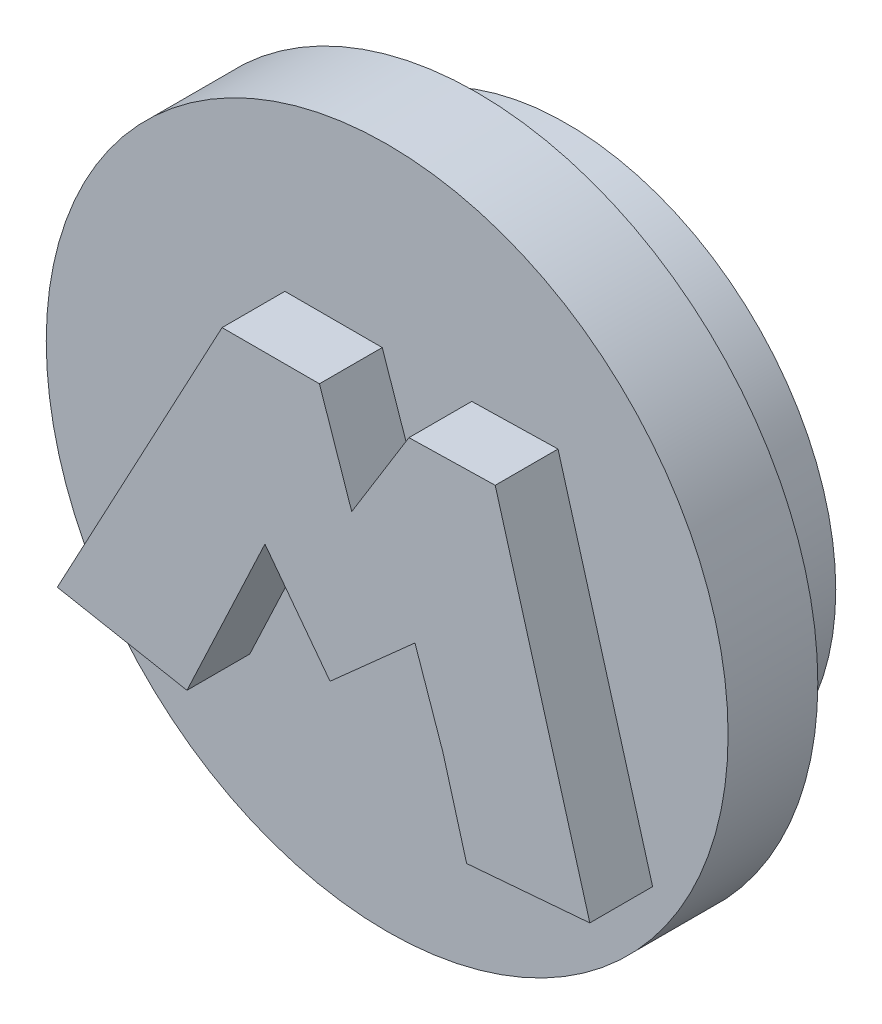
ISO-10303-21;
HEADER;
FILE_DESCRIPTION(('STEP AP214'),'2;1');
FILE_NAME('part.step','',(''),(''),'','','');
FILE_SCHEMA(('AUTOMOTIVE_DESIGN { 1 0 10303 214 1 1 1 1 }'));
ENDSEC;
DATA;
#1=APPLICATION_CONTEXT('core data for automotive mechanical design processes');
#2=APPLICATION_PROTOCOL_DEFINITION('international standard','automotive_design',2000,#1);
#3=PRODUCT_CONTEXT('',#1,'mechanical');
#4=PRODUCT('Part','Part','',(#3));
#5=PRODUCT_RELATED_PRODUCT_CATEGORY('part','',(#4));
#6=PRODUCT_DEFINITION_FORMATION('','',#4);
#7=PRODUCT_DEFINITION_CONTEXT('part definition',#1,'design');
#8=PRODUCT_DEFINITION('design','',#6,#7);
#9=PRODUCT_DEFINITION_SHAPE('','',#8);
#10=(LENGTH_UNIT() NAMED_UNIT(*) SI_UNIT(.MILLI.,.METRE.));
#11=(NAMED_UNIT(*) PLANE_ANGLE_UNIT() SI_UNIT($,.RADIAN.));
#12=(NAMED_UNIT(*) SI_UNIT($,.STERADIAN.) SOLID_ANGLE_UNIT());
#13=UNCERTAINTY_MEASURE_WITH_UNIT(LENGTH_MEASURE(1.E-05),#10,'distance_accuracy_value','');
#14=(GEOMETRIC_REPRESENTATION_CONTEXT(3) GLOBAL_UNCERTAINTY_ASSIGNED_CONTEXT((#13)) GLOBAL_UNIT_ASSIGNED_CONTEXT((#10,
#11,#12)) REPRESENTATION_CONTEXT('',''));
#15=CARTESIAN_POINT('',(0.,0.,0.));
#16=DIRECTION('',(0.,0.,1.));
#17=DIRECTION('',(1.,0.,0.));
#18=AXIS2_PLACEMENT_3D('',#15,#16,#17);
#19=CARTESIAN_POINT('',(0.,0.,2.5));
#20=DIRECTION('',(0.,0.,1.));
#21=DIRECTION('',(1.,0.,0.));
#22=AXIS2_PLACEMENT_3D('',#19,#20,#21);
#23=PLANE('',#22);
#24=CARTESIAN_POINT('',(0.,0.,2.5));
#25=DIRECTION('',(0.,0.,1.));
#26=DIRECTION('',(1.,0.,0.));
#27=AXIS2_PLACEMENT_3D('',#24,#25,#26);
#28=CIRCLE('',#27,19.);
#29=CARTESIAN_POINT('',(19.,0.,2.5));
#30=VERTEX_POINT('',#29);
#31=EDGE_CURVE('E55',#30,#30,#28,.T.);
#32=ORIENTED_EDGE('',*,*,#31,.T.);
#33=EDGE_LOOP('',(#32));
#34=FACE_BOUND('',#33,.T.);
#35=DIRECTION('',(-0.425937528266474,-0.904752575024933,0.));
#36=VECTOR('',#35,1.);
#37=CARTESIAN_POINT('',(-3.31142578125,-0.203388671875002,2.5));
#38=LINE('',#37,#36);
#39=CARTESIAN_POINT('',(-3.31142578125,-0.203388671875002,2.5));
#40=VERTEX_POINT('',#39);
#41=CARTESIAN_POINT('',(-7.65720703125,-9.434453125,2.5));
#42=VERTEX_POINT('',#41);
#43=EDGE_CURVE('E227',#40,#42,#38,.T.);
#44=ORIENTED_EDGE('',*,*,#43,.T.);
#45=DIRECTION('',(-0.982699902127382,0.185205027898364,0.));
#46=VECTOR('',#45,1.);
#47=CARTESIAN_POINT('',(-7.65720703125,-9.434453125,2.5));
#48=LINE('',#47,#46);
#49=CARTESIAN_POINT('',(-14.8828125,-8.07267578125,2.5));
#50=VERTEX_POINT('',#49);
#51=EDGE_CURVE('E63',#42,#50,#48,.T.);
#52=ORIENTED_EDGE('',*,*,#51,.T.);
#53=DIRECTION('',(0.472614608135408,0.881269216628503,0.));
#54=VECTOR('',#53,1.);
#55=CARTESIAN_POINT('',(-14.8828125,-8.07267578125,2.5));
#56=LINE('',#55,#54);
#57=CARTESIAN_POINT('',(-5.7001171875,9.05,2.5));
#58=VERTEX_POINT('',#57);
#59=EDGE_CURVE('E186',#50,#58,#56,.T.);
#60=ORIENTED_EDGE('',*,*,#59,.T.);
#61=DIRECTION('',(1.,0.,0.));
#62=VECTOR('',#61,1.);
#63=CARTESIAN_POINT('',(-5.7001171875,9.05,2.5));
#64=LINE('',#63,#62);
#65=CARTESIAN_POINT('',(-0.275332031249999,9.05,2.5));
#66=VERTEX_POINT('',#65);
#67=EDGE_CURVE('E190',#58,#66,#64,.T.);
#68=ORIENTED_EDGE('',*,*,#67,.T.);
#69=DIRECTION('',(0.323435777022933,-0.946250124513372,0.));
#70=VECTOR('',#69,1.);
#71=CARTESIAN_POINT('',(-0.275332031249999,9.05,2.5));
#72=LINE('',#71,#70);
#73=CARTESIAN_POINT('',(1.52548828125,3.781484375,2.5));
#74=VERTEX_POINT('',#73);
#75=EDGE_CURVE('E194',#66,#74,#72,.T.);
#76=ORIENTED_EDGE('',*,*,#75,.T.);
#77=DIRECTION('',(0.525362362031234,0.850878598015582,0.));
#78=VECTOR('',#77,1.);
#79=CARTESIAN_POINT('',(1.52548828125,3.781484375,2.5));
#80=LINE('',#79,#78);
#81=CARTESIAN_POINT('',(4.714130859375,8.9458203125,2.5));
#82=VERTEX_POINT('',#81);
#83=EDGE_CURVE('E198',#74,#82,#80,.T.);
#84=ORIENTED_EDGE('',*,*,#83,.T.);
#85=DIRECTION('',(0.999765248653533,0.0216667391349064,0.));
#86=VECTOR('',#85,1.);
#87=CARTESIAN_POINT('',(4.714130859375,8.9458203125,2.5));
#88=LINE('',#87,#86);
#89=CARTESIAN_POINT('',(9.521279296875,9.05,2.5));
#90=VERTEX_POINT('',#89);
#91=EDGE_CURVE('E202',#82,#90,#88,.T.);
#92=ORIENTED_EDGE('',*,*,#91,.T.);
#93=DIRECTION('',(0.274286483894829,-0.961648025398384,0.));
#94=VECTOR('',#93,1.);
#95=CARTESIAN_POINT('',(9.521279296875,9.05,2.5));
#96=LINE('',#95,#94);
#97=CARTESIAN_POINT('',(14.793515625,-9.434453125,2.5));
#98=VERTEX_POINT('',#97);
#99=EDGE_CURVE('E206',#90,#98,#96,.T.);
#100=ORIENTED_EDGE('',*,*,#99,.T.);
#101=DIRECTION('',(-0.996623548350577,-0.0821066554738686,0.));
#102=VECTOR('',#101,1.);
#103=CARTESIAN_POINT('',(14.793515625,-9.434453125,2.5));
#104=LINE('',#103,#102);
#105=CARTESIAN_POINT('',(7.928818359375,-10.,2.5));
#106=VERTEX_POINT('',#105);
#107=EDGE_CURVE('E210',#98,#106,#104,.T.);
#108=ORIENTED_EDGE('',*,*,#107,.T.);
#109=DIRECTION('',(-0.270169263356515,0.962812842216699,0.));
#110=VECTOR('',#109,1.);
#111=CARTESIAN_POINT('',(7.928818359375,-10.,2.5));
#112=LINE('',#111,#110);
#113=CARTESIAN_POINT('',(6.61541015625,-5.31935546875,2.5));
#114=VERTEX_POINT('',#113);
#115=EDGE_CURVE('E214',#106,#114,#112,.T.);
#116=ORIENTED_EDGE('',*,*,#115,.T.);
#117=DIRECTION('',(-0.327163944865108,0.944967593719647,0.));
#118=VECTOR('',#117,1.);
#119=CARTESIAN_POINT('',(6.61541015625,-5.31935546875,2.5));
#120=LINE('',#119,#118);
#121=CARTESIAN_POINT('',(5.048994140625,-0.794980468750003,2.5));
#122=VERTEX_POINT('',#121);
#123=EDGE_CURVE('E218',#114,#122,#120,.T.);
#124=ORIENTED_EDGE('',*,*,#123,.T.);
#125=DIRECTION('',(-0.746728757655878,-0.66512868115103,0.));
#126=VECTOR('',#125,1.);
#127=CARTESIAN_POINT('',(5.048994140625,-0.794980468750003,2.5));
#128=LINE('',#127,#126);
#129=CARTESIAN_POINT('',(0.316259765625002,-5.010537109375,2.5));
#130=VERTEX_POINT('',#129);
#131=EDGE_CURVE('E222',#122,#130,#128,.T.);
#132=ORIENTED_EDGE('',*,*,#131,.T.);
#133=DIRECTION('',(-0.602369771893019,0.798217174652082,0.));
#134=VECTOR('',#133,1.);
#135=CARTESIAN_POINT('',(0.316259765625002,-5.010537109375,2.5));
#136=LINE('',#135,#134);
#137=EDGE_CURVE('E155',#130,#40,#136,.T.);
#138=ORIENTED_EDGE('',*,*,#137,.T.);
#139=EDGE_LOOP('',(#44,#52,#60,#68,#76,#84,#92,#100,#108,#116,#124,#132,#138));
#140=FACE_BOUND('',#139,.T.);
#141=ADVANCED_FACE('F45',(#34,#140),#23,.T.);
#142=CARTESIAN_POINT('',(0.,0.,2.5));
#143=DIRECTION('',(0.,0.,-1.));
#144=DIRECTION('',(-1.,0.,0.));
#145=AXIS2_PLACEMENT_3D('',#142,#143,#144);
#146=CYLINDRICAL_SURFACE('',#145,19.);
#147=ORIENTED_EDGE('',*,*,#31,.F.);
#148=EDGE_LOOP('',(#147));
#149=FACE_BOUND('',#148,.T.);
#150=CARTESIAN_POINT('',(0.,0.,-2.5));
#151=DIRECTION('',(0.,0.,1.));
#152=DIRECTION('',(1.,0.,0.));
#153=AXIS2_PLACEMENT_3D('',#150,#151,#152);
#154=CIRCLE('',#153,19.);
#155=CARTESIAN_POINT('',(19.,0.,-2.5));
#156=VERTEX_POINT('',#155);
#157=EDGE_CURVE('E49',#156,#156,#154,.T.);
#158=ORIENTED_EDGE('',*,*,#157,.T.);
#159=EDGE_LOOP('',(#158));
#160=FACE_BOUND('',#159,.T.);
#161=ADVANCED_FACE('F47',(#149,#160),#146,.T.);
#162=CARTESIAN_POINT('',(0.,0.,-2.5));
#163=DIRECTION('',(0.,0.,1.));
#164=DIRECTION('',(1.,0.,0.));
#165=AXIS2_PLACEMENT_3D('',#162,#163,#164);
#166=PLANE('',#165);
#167=CARTESIAN_POINT('',(0.,0.,-2.5));
#168=DIRECTION('',(0.,0.,-1.));
#169=DIRECTION('',(-1.,0.,0.));
#170=AXIS2_PLACEMENT_3D('',#167,#168,#169);
#171=CIRCLE('',#170,15.);
#172=CARTESIAN_POINT('',(-15.,0.,-2.5));
#173=VERTEX_POINT('',#172);
#174=EDGE_CURVE('E11',#173,#173,#171,.T.);
#175=ORIENTED_EDGE('',*,*,#174,.F.);
#176=EDGE_LOOP('',(#175));
#177=FACE_BOUND('',#176,.T.);
#178=ORIENTED_EDGE('',*,*,#157,.F.);
#179=EDGE_LOOP('',(#178));
#180=FACE_BOUND('',#179,.T.);
#181=ADVANCED_FACE('F276',(#177,#180),#166,.F.);
#182=CARTESIAN_POINT('',(0.,0.,-7.5));
#183=DIRECTION('',(0.,0.,1.));
#184=DIRECTION('',(1.,0.,0.));
#185=AXIS2_PLACEMENT_3D('',#182,#183,#184);
#186=CYLINDRICAL_SURFACE('',#185,15.);
#187=CARTESIAN_POINT('',(0.,0.,-7.5));
#188=DIRECTION('',(0.,0.,-1.));
#189=DIRECTION('',(-1.,0.,0.));
#190=AXIS2_PLACEMENT_3D('',#187,#188,#189);
#191=CIRCLE('',#190,15.);
#192=CARTESIAN_POINT('',(-15.,0.,-7.5));
#193=VERTEX_POINT('',#192);
#194=EDGE_CURVE('E234',#193,#193,#191,.T.);
#195=ORIENTED_EDGE('',*,*,#194,.F.);
#196=EDGE_LOOP('',(#195));
#197=FACE_BOUND('',#196,.T.);
#198=ORIENTED_EDGE('',*,*,#174,.T.);
#199=EDGE_LOOP('',(#198));
#200=FACE_BOUND('',#199,.T.);
#201=ADVANCED_FACE('F278',(#197,#200),#186,.T.);
#202=CARTESIAN_POINT('',(0.,0.,-7.5));
#203=DIRECTION('',(0.,0.,-1.));
#204=DIRECTION('',(-1.,0.,0.));
#205=AXIS2_PLACEMENT_3D('',#202,#203,#204);
#206=PLANE('',#205);
#207=ORIENTED_EDGE('',*,*,#194,.T.);
#208=EDGE_LOOP('',(#207));
#209=FACE_BOUND('',#208,.T.);
#210=ADVANCED_FACE('F284',(#209),#206,.T.);
#211=CARTESIAN_POINT('',(-7.65720703125,-9.434453125,6.));
#212=DIRECTION('',(-0.185205027898364,-0.982699902127382,0.));
#213=DIRECTION('',(0.982699902127382,-0.185205027898364,0.));
#214=AXIS2_PLACEMENT_3D('',#211,#212,#213);
#215=PLANE('',#214);
#216=ORIENTED_EDGE('',*,*,#51,.F.);
#217=DIRECTION('',(0.,0.,-1.));
#218=VECTOR('',#217,1.);
#219=CARTESIAN_POINT('',(-7.65720703125,-9.434453125,6.));
#220=LINE('',#219,#218);
#221=CARTESIAN_POINT('',(-7.65720703125,-9.434453125,6.));
#222=VERTEX_POINT('',#221);
#223=EDGE_CURVE('E68',#222,#42,#220,.T.);
#224=ORIENTED_EDGE('',*,*,#223,.F.);
#225=DIRECTION('',(-0.982699902127382,0.185205027898364,0.));
#226=VECTOR('',#225,1.);
#227=CARTESIAN_POINT('',(-7.65720703125,-9.434453125,6.));
#228=LINE('',#227,#226);
#229=CARTESIAN_POINT('',(-14.8828125,-8.07267578125,6.));
#230=VERTEX_POINT('',#229);
#231=EDGE_CURVE('E231',#222,#230,#228,.T.);
#232=ORIENTED_EDGE('',*,*,#231,.T.);
#233=DIRECTION('',(0.,0.,-1.));
#234=VECTOR('',#233,1.);
#235=CARTESIAN_POINT('',(-14.8828125,-8.07267578125,6.));
#236=LINE('',#235,#234);
#237=EDGE_CURVE('E120',#230,#50,#236,.T.);
#238=ORIENTED_EDGE('',*,*,#237,.T.);
#239=EDGE_LOOP('',(#216,#224,#232,#238));
#240=FACE_BOUND('',#239,.T.);
#241=ADVANCED_FACE('F298',(#240),#215,.T.);
#242=CARTESIAN_POINT('',(-3.31142578125,-0.203388671875002,6.));
#243=DIRECTION('',(0.904752575024933,-0.425937528266474,0.));
#244=DIRECTION('',(0.425937528266474,0.904752575024933,0.));
#245=AXIS2_PLACEMENT_3D('',#242,#243,#244);
#246=PLANE('',#245);
#247=ORIENTED_EDGE('',*,*,#43,.F.);
#248=DIRECTION('',(0.,0.,-1.));
#249=VECTOR('',#248,1.);
#250=CARTESIAN_POINT('',(-3.31142578125,-0.203388671875002,6.));
#251=LINE('',#250,#249);
#252=CARTESIAN_POINT('',(-3.31142578125,-0.203388671875002,6.));
#253=VERTEX_POINT('',#252);
#254=EDGE_CURVE('E112',#253,#40,#251,.T.);
#255=ORIENTED_EDGE('',*,*,#254,.F.);
#256=DIRECTION('',(-0.425937528266474,-0.904752575024933,0.));
#257=VECTOR('',#256,1.);
#258=CARTESIAN_POINT('',(-3.31142578125,-0.203388671875002,6.));
#259=LINE('',#258,#257);
#260=EDGE_CURVE('E170',#253,#222,#259,.T.);
#261=ORIENTED_EDGE('',*,*,#260,.T.);
#262=ORIENTED_EDGE('',*,*,#223,.T.);
#263=EDGE_LOOP('',(#247,#255,#261,#262));
#264=FACE_BOUND('',#263,.T.);
#265=ADVANCED_FACE('F301',(#264),#246,.T.);
#266=CARTESIAN_POINT('',(0.316259765625002,-5.010537109375,6.));
#267=DIRECTION('',(-0.798217174652082,-0.602369771893019,0.));
#268=DIRECTION('',(0.602369771893019,-0.798217174652082,0.));
#269=AXIS2_PLACEMENT_3D('',#266,#267,#268);
#270=PLANE('',#269);
#271=ORIENTED_EDGE('',*,*,#137,.F.);
#272=DIRECTION('',(0.,0.,-1.));
#273=VECTOR('',#272,1.);
#274=CARTESIAN_POINT('',(0.316259765625002,-5.010537109375,6.));
#275=LINE('',#274,#273);
#276=CARTESIAN_POINT('',(0.316259765625002,-5.010537109375,6.));
#277=VERTEX_POINT('',#276);
#278=EDGE_CURVE('E149',#277,#130,#275,.T.);
#279=ORIENTED_EDGE('',*,*,#278,.F.);
#280=DIRECTION('',(-0.602369771893019,0.798217174652082,0.));
#281=VECTOR('',#280,1.);
#282=CARTESIAN_POINT('',(0.316259765625002,-5.010537109375,6.));
#283=LINE('',#282,#281);
#284=EDGE_CURVE('E152',#277,#253,#283,.T.);
#285=ORIENTED_EDGE('',*,*,#284,.T.);
#286=ORIENTED_EDGE('',*,*,#254,.T.);
#287=EDGE_LOOP('',(#271,#279,#285,#286));
#288=FACE_BOUND('',#287,.T.);
#289=ADVANCED_FACE('F151',(#288),#270,.T.);
#290=CARTESIAN_POINT('',(5.048994140625,-0.794980468750003,6.));
#291=DIRECTION('',(0.66512868115103,-0.746728757655878,0.));
#292=DIRECTION('',(0.746728757655878,0.66512868115103,0.));
#293=AXIS2_PLACEMENT_3D('',#290,#291,#292);
#294=PLANE('',#293);
#295=ORIENTED_EDGE('',*,*,#131,.F.);
#296=DIRECTION('',(0.,0.,-1.));
#297=VECTOR('',#296,1.);
#298=CARTESIAN_POINT('',(5.048994140625,-0.794980468750003,6.));
#299=LINE('',#298,#297);
#300=CARTESIAN_POINT('',(5.048994140625,-0.794980468750003,6.));
#301=VERTEX_POINT('',#300);
#302=EDGE_CURVE('E161',#301,#122,#299,.T.);
#303=ORIENTED_EDGE('',*,*,#302,.F.);
#304=DIRECTION('',(-0.746728757655878,-0.66512868115103,0.));
#305=VECTOR('',#304,1.);
#306=CARTESIAN_POINT('',(5.048994140625,-0.794980468750003,6.));
#307=LINE('',#306,#305);
#308=EDGE_CURVE('E167',#301,#277,#307,.T.);
#309=ORIENTED_EDGE('',*,*,#308,.T.);
#310=ORIENTED_EDGE('',*,*,#278,.T.);
#311=EDGE_LOOP('',(#295,#303,#309,#310));
#312=FACE_BOUND('',#311,.T.);
#313=ADVANCED_FACE('F173',(#312),#294,.T.);
#314=CARTESIAN_POINT('',(6.61541015625,-5.31935546875,6.));
#315=DIRECTION('',(-0.944967593719647,-0.327163944865108,0.));
#316=DIRECTION('',(0.327163944865108,-0.944967593719647,0.));
#317=AXIS2_PLACEMENT_3D('',#314,#315,#316);
#318=PLANE('',#317);
#319=ORIENTED_EDGE('',*,*,#123,.F.);
#320=DIRECTION('',(0.,0.,-1.));
#321=VECTOR('',#320,1.);
#322=CARTESIAN_POINT('',(6.61541015625,-5.31935546875,6.));
#323=LINE('',#322,#321);
#324=CARTESIAN_POINT('',(6.61541015625,-5.31935546875,6.));
#325=VERTEX_POINT('',#324);
#326=EDGE_CURVE('E239',#325,#114,#323,.T.);
#327=ORIENTED_EDGE('',*,*,#326,.F.);
#328=DIRECTION('',(-0.327163944865108,0.944967593719647,0.));
#329=VECTOR('',#328,1.);
#330=CARTESIAN_POINT('',(6.61541015625,-5.31935546875,6.));
#331=LINE('',#330,#329);
#332=EDGE_CURVE('E175',#325,#301,#331,.T.);
#333=ORIENTED_EDGE('',*,*,#332,.T.);
#334=ORIENTED_EDGE('',*,*,#302,.T.);
#335=EDGE_LOOP('',(#319,#327,#333,#334));
#336=FACE_BOUND('',#335,.T.);
#337=ADVANCED_FACE('F332',(#336),#318,.T.);
#338=CARTESIAN_POINT('',(7.928818359375,-10.,6.));
#339=DIRECTION('',(-0.962812842216699,-0.270169263356514,0.));
#340=DIRECTION('',(0.270169263356514,-0.962812842216699,0.));
#341=AXIS2_PLACEMENT_3D('',#338,#339,#340);
#342=PLANE('',#341);
#343=ORIENTED_EDGE('',*,*,#115,.F.);
#344=DIRECTION('',(0.,0.,-1.));
#345=VECTOR('',#344,1.);
#346=CARTESIAN_POINT('',(7.928818359375,-10.,6.));
#347=LINE('',#346,#345);
#348=CARTESIAN_POINT('',(7.928818359375,-10.,6.));
#349=VERTEX_POINT('',#348);
#350=EDGE_CURVE('E242',#349,#106,#347,.T.);
#351=ORIENTED_EDGE('',*,*,#350,.F.);
#352=DIRECTION('',(-0.270169263356515,0.962812842216699,0.));
#353=VECTOR('',#352,1.);
#354=CARTESIAN_POINT('',(7.928818359375,-10.,6.));
#355=LINE('',#354,#353);
#356=EDGE_CURVE('E178',#349,#325,#355,.T.);
#357=ORIENTED_EDGE('',*,*,#356,.T.);
#358=ORIENTED_EDGE('',*,*,#326,.T.);
#359=EDGE_LOOP('',(#343,#351,#357,#358));
#360=FACE_BOUND('',#359,.T.);
#361=ADVANCED_FACE('F328',(#360),#342,.T.);
#362=CARTESIAN_POINT('',(14.793515625,-9.434453125,6.));
#363=DIRECTION('',(0.0821066554738686,-0.996623548350577,0.));
#364=DIRECTION('',(0.996623548350577,0.0821066554738686,0.));
#365=AXIS2_PLACEMENT_3D('',#362,#363,#364);
#366=PLANE('',#365);
#367=ORIENTED_EDGE('',*,*,#107,.F.);
#368=DIRECTION('',(0.,0.,-1.));
#369=VECTOR('',#368,1.);
#370=CARTESIAN_POINT('',(14.793515625,-9.434453125,6.));
#371=LINE('',#370,#369);
#372=CARTESIAN_POINT('',(14.793515625,-9.434453125,6.));
#373=VERTEX_POINT('',#372);
#374=EDGE_CURVE('E245',#373,#98,#371,.T.);
#375=ORIENTED_EDGE('',*,*,#374,.F.);
#376=DIRECTION('',(-0.996623548350577,-0.0821066554738686,0.));
#377=VECTOR('',#376,1.);
#378=CARTESIAN_POINT('',(14.793515625,-9.434453125,6.));
#379=LINE('',#378,#377);
#380=EDGE_CURVE('E462',#373,#349,#379,.T.);
#381=ORIENTED_EDGE('',*,*,#380,.T.);
#382=ORIENTED_EDGE('',*,*,#350,.T.);
#383=EDGE_LOOP('',(#367,#375,#381,#382));
#384=FACE_BOUND('',#383,.T.);
#385=ADVANCED_FACE('F324',(#384),#366,.T.);
#386=CARTESIAN_POINT('',(9.521279296875,9.05,6.));
#387=DIRECTION('',(0.961648025398384,0.274286483894829,0.));
#388=DIRECTION('',(-0.274286483894829,0.961648025398384,0.));
#389=AXIS2_PLACEMENT_3D('',#386,#387,#388);
#390=PLANE('',#389);
#391=ORIENTED_EDGE('',*,*,#99,.F.);
#392=DIRECTION('',(0.,0.,-1.));
#393=VECTOR('',#392,1.);
#394=CARTESIAN_POINT('',(9.521279296875,9.05,6.));
#395=LINE('',#394,#393);
#396=CARTESIAN_POINT('',(9.521279296875,9.05,6.));
#397=VERTEX_POINT('',#396);
#398=EDGE_CURVE('E248',#397,#90,#395,.T.);
#399=ORIENTED_EDGE('',*,*,#398,.F.);
#400=DIRECTION('',(0.274286483894829,-0.961648025398384,0.));
#401=VECTOR('',#400,1.);
#402=CARTESIAN_POINT('',(9.521279296875,9.05,6.));
#403=LINE('',#402,#401);
#404=EDGE_CURVE('E464',#397,#373,#403,.T.);
#405=ORIENTED_EDGE('',*,*,#404,.T.);
#406=ORIENTED_EDGE('',*,*,#374,.T.);
#407=EDGE_LOOP('',(#391,#399,#405,#406));
#408=FACE_BOUND('',#407,.T.);
#409=ADVANCED_FACE('F320',(#408),#390,.T.);
#410=CARTESIAN_POINT('',(4.714130859375,8.9458203125,6.));
#411=DIRECTION('',(-0.0216667391349064,0.999765248653533,0.));
#412=DIRECTION('',(-0.999765248653533,-0.0216667391349064,0.));
#413=AXIS2_PLACEMENT_3D('',#410,#411,#412);
#414=PLANE('',#413);
#415=ORIENTED_EDGE('',*,*,#91,.F.);
#416=DIRECTION('',(0.,0.,-1.));
#417=VECTOR('',#416,1.);
#418=CARTESIAN_POINT('',(4.714130859375,8.9458203125,6.));
#419=LINE('',#418,#417);
#420=CARTESIAN_POINT('',(4.714130859375,8.9458203125,6.));
#421=VERTEX_POINT('',#420);
#422=EDGE_CURVE('E251',#421,#82,#419,.T.);
#423=ORIENTED_EDGE('',*,*,#422,.F.);
#424=DIRECTION('',(0.999765248653533,0.0216667391349064,0.));
#425=VECTOR('',#424,1.);
#426=CARTESIAN_POINT('',(4.714130859375,8.9458203125,6.));
#427=LINE('',#426,#425);
#428=EDGE_CURVE('E470',#421,#397,#427,.T.);
#429=ORIENTED_EDGE('',*,*,#428,.T.);
#430=ORIENTED_EDGE('',*,*,#398,.T.);
#431=EDGE_LOOP('',(#415,#423,#429,#430));
#432=FACE_BOUND('',#431,.T.);
#433=ADVANCED_FACE('F316',(#432),#414,.T.);
#434=CARTESIAN_POINT('',(1.52548828125,3.781484375,6.));
#435=DIRECTION('',(-0.850878598015582,0.525362362031234,0.));
#436=DIRECTION('',(-0.525362362031234,-0.850878598015582,0.));
#437=AXIS2_PLACEMENT_3D('',#434,#435,#436);
#438=PLANE('',#437);
#439=ORIENTED_EDGE('',*,*,#83,.F.);
#440=DIRECTION('',(0.,0.,-1.));
#441=VECTOR('',#440,1.);
#442=CARTESIAN_POINT('',(1.52548828125,3.781484375,6.));
#443=LINE('',#442,#441);
#444=CARTESIAN_POINT('',(1.52548828125,3.781484375,6.));
#445=VERTEX_POINT('',#444);
#446=EDGE_CURVE('E254',#445,#74,#443,.T.);
#447=ORIENTED_EDGE('',*,*,#446,.F.);
#448=DIRECTION('',(0.525362362031234,0.850878598015582,0.));
#449=VECTOR('',#448,1.);
#450=CARTESIAN_POINT('',(1.52548828125,3.781484375,6.));
#451=LINE('',#450,#449);
#452=EDGE_CURVE('E474',#445,#421,#451,.T.);
#453=ORIENTED_EDGE('',*,*,#452,.T.);
#454=ORIENTED_EDGE('',*,*,#422,.T.);
#455=EDGE_LOOP('',(#439,#447,#453,#454));
#456=FACE_BOUND('',#455,.T.);
#457=ADVANCED_FACE('F312',(#456),#438,.T.);
#458=CARTESIAN_POINT('',(-0.275332031249999,9.05,6.));
#459=DIRECTION('',(0.946250124513372,0.323435777022933,0.));
#460=DIRECTION('',(-0.323435777022933,0.946250124513372,0.));
#461=AXIS2_PLACEMENT_3D('',#458,#459,#460);
#462=PLANE('',#461);
#463=ORIENTED_EDGE('',*,*,#75,.F.);
#464=DIRECTION('',(0.,0.,-1.));
#465=VECTOR('',#464,1.);
#466=CARTESIAN_POINT('',(-0.275332031249999,9.05,6.));
#467=LINE('',#466,#465);
#468=CARTESIAN_POINT('',(-0.275332031249999,9.05,6.));
#469=VERTEX_POINT('',#468);
#470=EDGE_CURVE('E257',#469,#66,#467,.T.);
#471=ORIENTED_EDGE('',*,*,#470,.F.);
#472=DIRECTION('',(0.323435777022933,-0.946250124513372,0.));
#473=VECTOR('',#472,1.);
#474=CARTESIAN_POINT('',(-0.275332031249999,9.05,6.));
#475=LINE('',#474,#473);
#476=EDGE_CURVE('E478',#469,#445,#475,.T.);
#477=ORIENTED_EDGE('',*,*,#476,.T.);
#478=ORIENTED_EDGE('',*,*,#446,.T.);
#479=EDGE_LOOP('',(#463,#471,#477,#478));
#480=FACE_BOUND('',#479,.T.);
#481=ADVANCED_FACE('F308',(#480),#462,.T.);
#482=CARTESIAN_POINT('',(-5.7001171875,9.05,6.));
#483=DIRECTION('',(0.,1.,0.));
#484=DIRECTION('',(0.,0.,1.));
#485=AXIS2_PLACEMENT_3D('',#482,#483,#484);
#486=PLANE('',#485);
#487=ORIENTED_EDGE('',*,*,#67,.F.);
#488=DIRECTION('',(0.,0.,-1.));
#489=VECTOR('',#488,1.);
#490=CARTESIAN_POINT('',(-5.7001171875,9.05,6.));
#491=LINE('',#490,#489);
#492=CARTESIAN_POINT('',(-5.7001171875,9.05,6.));
#493=VERTEX_POINT('',#492);
#494=EDGE_CURVE('E260',#493,#58,#491,.T.);
#495=ORIENTED_EDGE('',*,*,#494,.F.);
#496=DIRECTION('',(1.,0.,0.));
#497=VECTOR('',#496,1.);
#498=CARTESIAN_POINT('',(-5.7001171875,9.05,6.));
#499=LINE('',#498,#497);
#500=EDGE_CURVE('E482',#493,#469,#499,.T.);
#501=ORIENTED_EDGE('',*,*,#500,.T.);
#502=ORIENTED_EDGE('',*,*,#470,.T.);
#503=EDGE_LOOP('',(#487,#495,#501,#502));
#504=FACE_BOUND('',#503,.T.);
#505=ADVANCED_FACE('F305',(#504),#486,.T.);
#506=CARTESIAN_POINT('',(-14.8828125,-8.07267578125,6.));
#507=DIRECTION('',(-0.881269216628503,0.472614608135408,0.));
#508=DIRECTION('',(-0.472614608135408,-0.881269216628503,0.));
#509=AXIS2_PLACEMENT_3D('',#506,#507,#508);
#510=PLANE('',#509);
#511=ORIENTED_EDGE('',*,*,#59,.F.);
#512=ORIENTED_EDGE('',*,*,#237,.F.);
#513=DIRECTION('',(0.472614608135408,0.881269216628503,0.));
#514=VECTOR('',#513,1.);
#515=CARTESIAN_POINT('',(-14.8828125,-8.07267578125,6.));
#516=LINE('',#515,#514);
#517=EDGE_CURVE('E486',#230,#493,#516,.T.);
#518=ORIENTED_EDGE('',*,*,#517,.T.);
#519=ORIENTED_EDGE('',*,*,#494,.T.);
#520=EDGE_LOOP('',(#511,#512,#518,#519));
#521=FACE_BOUND('',#520,.T.);
#522=ADVANCED_FACE('F302',(#521),#510,.T.);
#523=CARTESIAN_POINT('',(0.,0.,6.));
#524=DIRECTION('',(0.,0.,1.));
#525=DIRECTION('',(1.,0.,0.));
#526=AXIS2_PLACEMENT_3D('',#523,#524,#525);
#527=PLANE('',#526);
#528=ORIENTED_EDGE('',*,*,#231,.F.);
#529=ORIENTED_EDGE('',*,*,#260,.F.);
#530=ORIENTED_EDGE('',*,*,#284,.F.);
#531=ORIENTED_EDGE('',*,*,#308,.F.);
#532=ORIENTED_EDGE('',*,*,#332,.F.);
#533=ORIENTED_EDGE('',*,*,#356,.F.);
#534=ORIENTED_EDGE('',*,*,#380,.F.);
#535=ORIENTED_EDGE('',*,*,#404,.F.);
#536=ORIENTED_EDGE('',*,*,#428,.F.);
#537=ORIENTED_EDGE('',*,*,#452,.F.);
#538=ORIENTED_EDGE('',*,*,#476,.F.);
#539=ORIENTED_EDGE('',*,*,#500,.F.);
#540=ORIENTED_EDGE('',*,*,#517,.F.);
#541=EDGE_LOOP('',(#528,#529,#530,#531,#532,#533,#534,#535,#536,#537,#538,#539,#540));
#542=FACE_BOUND('',#541,.T.);
#543=ADVANCED_FACE('F165',(#542),#527,.T.);
#544=CLOSED_SHELL('',(#141,#161,#181,#201,#210,#241,#265,#289,#313,#337,#361,#385,#409,#433,
#457,#481,#505,#522,#543));
#545=MANIFOLD_SOLID_BREP('B2',#544);
#546=ADVANCED_BREP_SHAPE_REPRESENTATION('',(#18,#545),#14);
#547=SHAPE_DEFINITION_REPRESENTATION(#9,#546);
ENDSEC;
END-ISO-10303-21;
